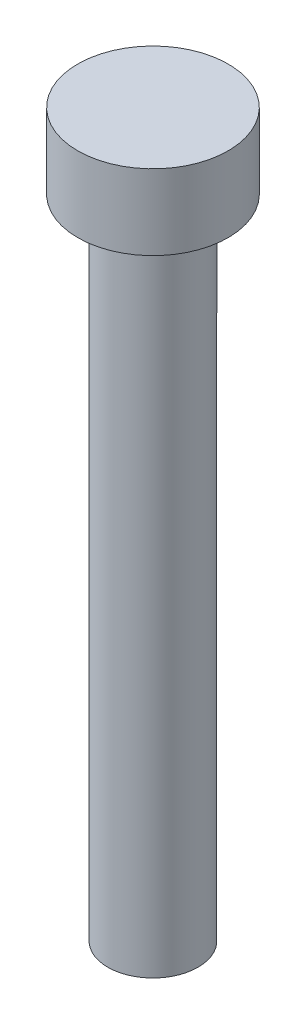
ISO-10303-21;
HEADER;
FILE_DESCRIPTION(('STEP AP214'),'2;1');
FILE_NAME('part.step','',(''),(''),'','','');
FILE_SCHEMA(('AUTOMOTIVE_DESIGN { 1 0 10303 214 1 1 1 1 }'));
ENDSEC;
DATA;
#1=APPLICATION_CONTEXT('core data for automotive mechanical design processes');
#2=APPLICATION_PROTOCOL_DEFINITION('international standard','automotive_design',2000,#1);
#3=PRODUCT_CONTEXT('',#1,'mechanical');
#4=PRODUCT('Part','Part','',(#3));
#5=PRODUCT_RELATED_PRODUCT_CATEGORY('part','',(#4));
#6=PRODUCT_DEFINITION_FORMATION('','',#4);
#7=PRODUCT_DEFINITION_CONTEXT('part definition',#1,'design');
#8=PRODUCT_DEFINITION('design','',#6,#7);
#9=PRODUCT_DEFINITION_SHAPE('','',#8);
#10=(LENGTH_UNIT() NAMED_UNIT(*) SI_UNIT(.MILLI.,.METRE.));
#11=(NAMED_UNIT(*) PLANE_ANGLE_UNIT() SI_UNIT($,.RADIAN.));
#12=(NAMED_UNIT(*) SI_UNIT($,.STERADIAN.) SOLID_ANGLE_UNIT());
#13=UNCERTAINTY_MEASURE_WITH_UNIT(LENGTH_MEASURE(1.E-05),#10,'distance_accuracy_value','');
#14=(GEOMETRIC_REPRESENTATION_CONTEXT(3) GLOBAL_UNCERTAINTY_ASSIGNED_CONTEXT((#13)) GLOBAL_UNIT_ASSIGNED_CONTEXT((#10,
#11,#12)) REPRESENTATION_CONTEXT('',''));
#15=CARTESIAN_POINT('',(0.,0.,0.));
#16=DIRECTION('',(0.,0.,1.));
#17=DIRECTION('',(1.,0.,0.));
#18=AXIS2_PLACEMENT_3D('',#15,#16,#17);
#19=CARTESIAN_POINT('',(0.,-8.89,0.));
#20=DIRECTION('',(0.,1.,0.));
#21=DIRECTION('',(0.,0.,1.));
#22=AXIS2_PLACEMENT_3D('',#19,#20,#21);
#23=CYLINDRICAL_SURFACE('',#22,3.048);
#24=CARTESIAN_POINT('',(0.,29.718,0.));
#25=DIRECTION('',(0.,1.,0.));
#26=DIRECTION('',(0.,0.,1.));
#27=AXIS2_PLACEMENT_3D('',#24,#25,#26);
#28=CIRCLE('',#27,3.048);
#29=CARTESIAN_POINT('',(0.,29.718,3.048));
#30=VERTEX_POINT('',#29);
#31=EDGE_CURVE('E10',#30,#30,#28,.T.);
#32=ORIENTED_EDGE('',*,*,#31,.F.);
#33=EDGE_LOOP('',(#32));
#34=FACE_BOUND('',#33,.T.);
#35=CARTESIAN_POINT('',(0.,-13.97,0.));
#36=DIRECTION('',(0.,-1.,0.));
#37=DIRECTION('',(0.,0.,-1.));
#38=AXIS2_PLACEMENT_3D('',#35,#36,#37);
#39=CIRCLE('',#38,3.048);
#40=CARTESIAN_POINT('',(0.,-13.97,-3.048));
#41=VERTEX_POINT('',#40);
#42=EDGE_CURVE('E46',#41,#41,#39,.T.);
#43=ORIENTED_EDGE('',*,*,#42,.F.);
#44=EDGE_LOOP('',(#43));
#45=FACE_BOUND('',#44,.T.);
#46=ADVANCED_FACE('F31',(#34,#45),#23,.T.);
#47=CARTESIAN_POINT('',(0.,34.798,0.));
#48=DIRECTION('',(0.,-1.,0.));
#49=DIRECTION('',(0.,0.,-1.));
#50=AXIS2_PLACEMENT_3D('',#47,#48,#49);
#51=CYLINDRICAL_SURFACE('',#50,5.08);
#52=CARTESIAN_POINT('',(0.,34.798,0.));
#53=DIRECTION('',(0.,1.,0.));
#54=DIRECTION('',(0.,0.,1.));
#55=AXIS2_PLACEMENT_3D('',#52,#53,#54);
#56=CIRCLE('',#55,5.08);
#57=CARTESIAN_POINT('',(0.,34.798,5.08));
#58=VERTEX_POINT('',#57);
#59=EDGE_CURVE('E37',#58,#58,#56,.T.);
#60=ORIENTED_EDGE('',*,*,#59,.F.);
#61=EDGE_LOOP('',(#60));
#62=FACE_BOUND('',#61,.T.);
#63=CARTESIAN_POINT('',(0.,29.718,0.));
#64=DIRECTION('',(0.,1.,0.));
#65=DIRECTION('',(0.,0.,1.));
#66=AXIS2_PLACEMENT_3D('',#63,#64,#65);
#67=CIRCLE('',#66,5.08);
#68=CARTESIAN_POINT('',(0.,29.718,5.08));
#69=VERTEX_POINT('',#68);
#70=EDGE_CURVE('E41',#69,#69,#67,.T.);
#71=ORIENTED_EDGE('',*,*,#70,.T.);
#72=EDGE_LOOP('',(#71));
#73=FACE_BOUND('',#72,.T.);
#74=ADVANCED_FACE('F54',(#62,#73),#51,.T.);
#75=CARTESIAN_POINT('',(0.,34.798,0.));
#76=DIRECTION('',(0.,1.,0.));
#77=DIRECTION('',(0.,0.,1.));
#78=AXIS2_PLACEMENT_3D('',#75,#76,#77);
#79=PLANE('',#78);
#80=ORIENTED_EDGE('',*,*,#59,.T.);
#81=EDGE_LOOP('',(#80));
#82=FACE_BOUND('',#81,.T.);
#83=ADVANCED_FACE('F59',(#82),#79,.T.);
#84=CARTESIAN_POINT('',(0.,29.718,0.));
#85=DIRECTION('',(0.,1.,0.));
#86=DIRECTION('',(0.,0.,1.));
#87=AXIS2_PLACEMENT_3D('',#84,#85,#86);
#88=PLANE('',#87);
#89=ORIENTED_EDGE('',*,*,#31,.T.);
#90=EDGE_LOOP('',(#89));
#91=FACE_BOUND('',#90,.T.);
#92=ORIENTED_EDGE('',*,*,#70,.F.);
#93=EDGE_LOOP('',(#92));
#94=FACE_BOUND('',#93,.T.);
#95=ADVANCED_FACE('F64',(#91,#94),#88,.F.);
#96=CARTESIAN_POINT('',(0.,-13.97,0.));
#97=DIRECTION('',(0.,-1.,0.));
#98=DIRECTION('',(0.,0.,-1.));
#99=AXIS2_PLACEMENT_3D('',#96,#97,#98);
#100=PLANE('',#99);
#101=ORIENTED_EDGE('',*,*,#42,.T.);
#102=EDGE_LOOP('',(#101));
#103=FACE_BOUND('',#102,.T.);
#104=ADVANCED_FACE('F51',(#103),#100,.T.);
#105=CLOSED_SHELL('',(#46,#74,#83,#95,#104));
#106=MANIFOLD_SOLID_BREP('B2',#105);
#107=ADVANCED_BREP_SHAPE_REPRESENTATION('',(#18,#106),#14);
#108=SHAPE_DEFINITION_REPRESENTATION(#9,#107);
ENDSEC;
END-ISO-10303-21;
